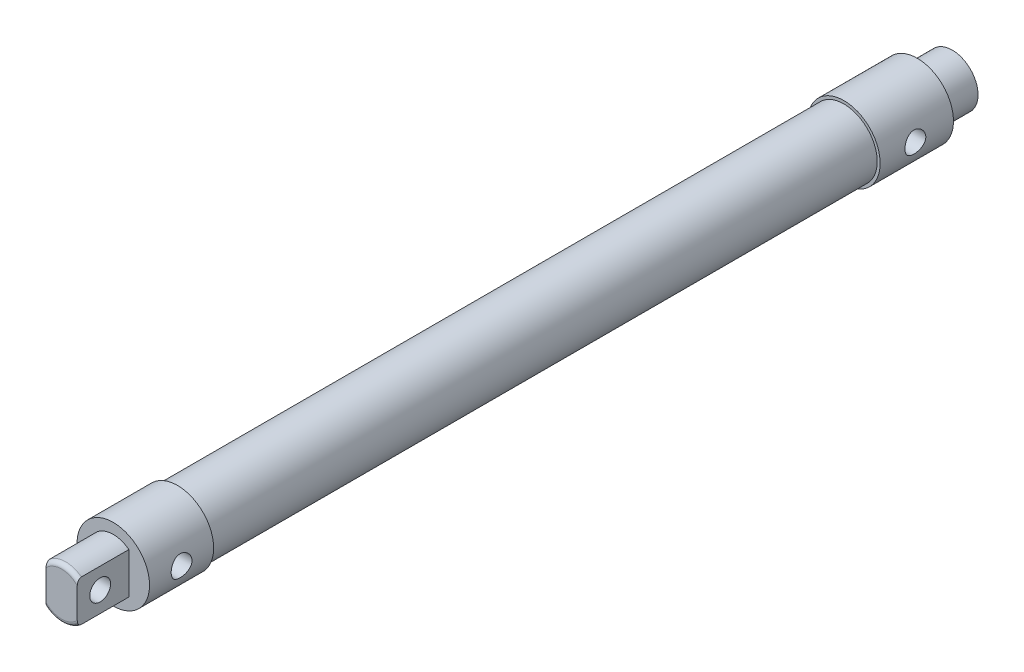
ISO-10303-21;
HEADER;
FILE_DESCRIPTION(('STEP AP214'),'2;1');
FILE_NAME('part.step','',(''),(''),'','','');
FILE_SCHEMA(('AUTOMOTIVE_DESIGN { 1 0 10303 214 1 1 1 1 }'));
ENDSEC;
DATA;
#1=APPLICATION_CONTEXT('core data for automotive mechanical design processes');
#2=APPLICATION_PROTOCOL_DEFINITION('international standard','automotive_design',2000,#1);
#3=PRODUCT_CONTEXT('',#1,'mechanical');
#4=PRODUCT('Part','Part','',(#3));
#5=PRODUCT_RELATED_PRODUCT_CATEGORY('part','',(#4));
#6=PRODUCT_DEFINITION_FORMATION('','',#4);
#7=PRODUCT_DEFINITION_CONTEXT('part definition',#1,'design');
#8=PRODUCT_DEFINITION('design','',#6,#7);
#9=PRODUCT_DEFINITION_SHAPE('','',#8);
#10=(LENGTH_UNIT() NAMED_UNIT(*) SI_UNIT(.MILLI.,.METRE.));
#11=(NAMED_UNIT(*) PLANE_ANGLE_UNIT() SI_UNIT($,.RADIAN.));
#12=(NAMED_UNIT(*) SI_UNIT($,.STERADIAN.) SOLID_ANGLE_UNIT());
#13=UNCERTAINTY_MEASURE_WITH_UNIT(LENGTH_MEASURE(1.E-05),#10,'distance_accuracy_value','');
#14=(GEOMETRIC_REPRESENTATION_CONTEXT(3) GLOBAL_UNCERTAINTY_ASSIGNED_CONTEXT((#13)) GLOBAL_UNIT_ASSIGNED_CONTEXT((#10,
#11,#12)) REPRESENTATION_CONTEXT('',''));
#15=CARTESIAN_POINT('',(0.,0.,0.));
#16=DIRECTION('',(0.,0.,1.));
#17=DIRECTION('',(1.,0.,0.));
#18=AXIS2_PLACEMENT_3D('',#15,#16,#17);
#19=CARTESIAN_POINT('',(0.,0.,222.758));
#20=DIRECTION('',(0.,0.,-1.));
#21=DIRECTION('',(-1.,0.,0.));
#22=AXIS2_PLACEMENT_3D('',#19,#20,#21);
#23=CYLINDRICAL_SURFACE('',#22,11.049);
#24=CARTESIAN_POINT('',(0.,0.,222.758));
#25=DIRECTION('',(0.,0.,1.));
#26=DIRECTION('',(1.,0.,0.));
#27=AXIS2_PLACEMENT_3D('',#24,#25,#26);
#28=CIRCLE('',#27,11.049);
#29=CARTESIAN_POINT('',(11.049,0.,222.758));
#30=VERTEX_POINT('',#29);
#31=EDGE_CURVE('E137',#30,#30,#28,.T.);
#32=ORIENTED_EDGE('',*,*,#31,.F.);
#33=EDGE_LOOP('',(#32));
#34=FACE_BOUND('',#33,.T.);
#35=CARTESIAN_POINT('',(0.,0.,203.2));
#36=DIRECTION('',(0.,0.,1.));
#37=DIRECTION('',(1.,0.,0.));
#38=AXIS2_PLACEMENT_3D('',#35,#36,#37);
#39=CIRCLE('',#38,11.049);
#40=CARTESIAN_POINT('',(11.049,0.,203.2));
#41=VERTEX_POINT('',#40);
#42=EDGE_CURVE('E110',#41,#41,#39,.T.);
#43=ORIENTED_EDGE('',*,*,#42,.T.);
#44=EDGE_LOOP('',(#43));
#45=FACE_BOUND('',#44,.T.);
#46=CARTESIAN_POINT('',(10.5829946612478,-3.175,212.979));
#47=CARTESIAN_POINT('',(10.5829970378921,-3.17499696173694,213.153343169612));
#48=CARTESIAN_POINT('',(10.5873499628536,-3.16059101598809,213.327716945003));
#49=CARTESIAN_POINT('',(10.6042287733974,-3.10348071440142,213.671390818407));
#50=CARTESIAN_POINT('',(10.6167579154399,-3.06076508315063,213.840688866724));
#51=CARTESIAN_POINT('',(10.6484555361327,-2.94858604276688,214.169188103751));
#52=CARTESIAN_POINT('',(10.6676136440502,-2.87916439519901,214.328404607024));
#53=CARTESIAN_POINT('',(10.7103968556723,-2.71567886194748,214.632964989182));
#54=CARTESIAN_POINT('',(10.7340225055439,-2.62161196278527,214.778307168628));
#55=CARTESIAN_POINT('',(10.7838478929209,-2.40858326173654,215.055212977893));
#56=CARTESIAN_POINT('',(10.8100989589948,-2.28903221307922,215.18631415544));
#57=CARTESIAN_POINT('',(10.8617771284488,-2.02969339145334,215.42690970103));
#58=CARTESIAN_POINT('',(10.8872041340175,-1.88990322690513,215.536401511957));
#59=CARTESIAN_POINT('',(10.9349482869144,-1.59079703436562,215.732647008809));
#60=CARTESIAN_POINT('',(10.9571978703645,-1.43116293599984,215.818933781985));
#61=CARTESIAN_POINT('',(10.9954868205641,-1.09890403668003,215.96326239608));
#62=CARTESIAN_POINT('',(11.0115274108589,-0.926281803186645,216.021309802432));
#63=CARTESIAN_POINT('',(11.0352279538983,-0.577780737066111,216.105994767518));
#64=CARTESIAN_POINT('',(11.0430978601515,-0.402107999548955,216.133420654298));
#65=CARTESIAN_POINT('',(11.0503076095615,-0.0484902253797454,216.158571865806));
#66=CARTESIAN_POINT('',(11.0496491013871,0.129454365444983,216.156302930981));
#67=CARTESIAN_POINT('',(11.0400267625263,0.477051272742436,216.122668276694));
#68=CARTESIAN_POINT('',(11.0313063870296,0.646793905386206,216.092155443166));
#69=CARTESIAN_POINT('',(11.0068326238017,0.978639250638344,216.004286301785));
#70=CARTESIAN_POINT('',(10.991078806017,1.14074149541178,215.9469283525));
#71=CARTESIAN_POINT('',(10.9539621303433,1.45479040406771,215.806390262368));
#72=CARTESIAN_POINT('',(10.9325393858836,1.60660549873713,215.722932582088));
#73=CARTESIAN_POINT('',(10.8863714985496,1.89435605989025,215.532780903117));
#74=CARTESIAN_POINT('',(10.8616256211488,2.03028800319436,215.426081764014));
#75=CARTESIAN_POINT('',(10.8104367437012,2.28750533131606,215.188010769114));
#76=CARTESIAN_POINT('',(10.7839646808932,2.4080998224991,215.055897758046));
#77=CARTESIAN_POINT('',(10.733084389821,2.62560689303648,214.773057770274));
#78=CARTESIAN_POINT('',(10.7086763331534,2.72251750463205,214.622329248477));
#79=CARTESIAN_POINT('',(10.6645569111701,2.89054812362864,214.304845080252));
#80=CARTESIAN_POINT('',(10.6448854814472,2.96145130546497,214.137968727805));
#81=CARTESIAN_POINT('',(10.6129476152519,3.07395555813915,213.793952244113));
#82=CARTESIAN_POINT('',(10.6006789953196,3.11556526969434,213.616815156186));
#83=CARTESIAN_POINT('',(10.585409663935,3.16704977828252,213.263836916255));
#84=CARTESIAN_POINT('',(10.5821046142205,3.17796715559108,213.088160853244));
#85=CARTESIAN_POINT('',(10.5842985066283,3.17065339734403,212.73748705244));
#86=CARTESIAN_POINT('',(10.5897963357224,3.15242594683498,212.562489231694));
#87=CARTESIAN_POINT('',(10.6086796202177,3.08826497319619,212.222355741259));
#88=CARTESIAN_POINT('',(10.6218788212302,3.04298510170738,212.057085396053));
#89=CARTESIAN_POINT('',(10.654488955992,2.92675343849824,211.736492795518));
#90=CARTESIAN_POINT('',(10.6739007932801,2.85579791242603,211.581171991154));
#91=CARTESIAN_POINT('',(10.7173525725105,2.68819763195384,211.280599406866));
#92=CARTESIAN_POINT('',(10.7414960228918,2.59095536802795,211.135696126875));
#93=CARTESIAN_POINT('',(10.7914602367789,2.37426353068631,210.86388230724));
#94=CARTESIAN_POINT('',(10.8172813672868,2.25480908751678,210.736975723931));
#95=CARTESIAN_POINT('',(10.8687608358398,1.99221286364236,210.500289244861));
#96=CARTESIAN_POINT('',(10.8943833784092,1.84840048120927,210.391243871948));
#97=CARTESIAN_POINT('',(10.9416824947104,1.54391896032716,210.198826470589));
#98=CARTESIAN_POINT('',(10.963359273833,1.38325069997256,210.115453105667));
#99=CARTESIAN_POINT('',(11.0001869824692,1.05072587538091,209.9775439009));
#100=CARTESIAN_POINT('',(11.0153871097535,0.878965503598176,209.922789914279));
#101=CARTESIAN_POINT('',(11.0377661850788,0.528171227762868,209.843080708093));
#102=CARTESIAN_POINT('',(11.0449472223555,0.349139230810322,209.818117726877));
#103=CARTESIAN_POINT('',(11.0503629040812,-0.0043004314825108,209.799249313813));
#104=CARTESIAN_POINT('',(11.0489056996126,-0.178647014664058,209.804274173031));
#105=CARTESIAN_POINT('',(11.0379233962819,-0.523908669717712,209.842710416543));
#106=CARTESIAN_POINT('',(11.0283986915624,-0.69482390881256,209.876120414065));
#107=CARTESIAN_POINT('',(11.0024294098578,-1.02686681719942,209.969737297699));
#108=CARTESIAN_POINT('',(10.9860488399852,-1.18806963267257,210.02969660909));
#109=CARTESIAN_POINT('',(10.9480678507565,-1.49821572280082,210.174489786631));
#110=CARTESIAN_POINT('',(10.9264666173167,-1.64715708060557,210.259327532639));
#111=CARTESIAN_POINT('',(10.8795235460163,-1.933403848412,210.454427082047));
#112=CARTESIAN_POINT('',(10.8540889319085,-2.0702261392825,210.565375246748));
#113=CARTESIAN_POINT('',(10.8026716112853,-2.32367039959815,210.808284755922));
#114=CARTESIAN_POINT('',(10.7766887543745,-2.44028674310768,210.940251933144));
#115=CARTESIAN_POINT('',(10.7263080053237,-2.65311527076296,211.225680346804));
#116=CARTESIAN_POINT('',(10.7019708346248,-2.74870060488381,211.379620812702));
#117=CARTESIAN_POINT('',(10.6585601925368,-2.91251111919759,211.702065252359));
#118=CARTESIAN_POINT('',(10.6394838228281,-2.98075137397165,211.870561139667));
#119=CARTESIAN_POINT('',(10.6109457090473,-3.08067604297107,212.194782717456));
#120=CARTESIAN_POINT('',(10.6005573203454,-3.11595595609863,212.349326717797));
#121=CARTESIAN_POINT('',(10.5865812685406,-3.16311741659185,212.662239141281));
#122=CARTESIAN_POINT('',(10.5829925020353,-3.17500276030191,212.820606939695));
#123=CARTESIAN_POINT('',(10.5829946612478,-3.175,212.979));
#124=B_SPLINE_CURVE_WITH_KNOTS('',3,(#46,#47,#48,#49,#50,#51,#52,#53,#54,#55,#56,#57,#58,#59,
#60,#61,#62,#63,#64,#65,#66,#67,#68,#69,#70,#71,#72,#73,#74,#75,#76,#77,#78,#79,#80,#81,#82,#83,
#84,#85,#86,#87,#88,#89,#90,#91,#92,#93,#94,#95,#96,#97,#98,#99,#100,#101,#102,#103,#104,#105,
#106,#107,#108,#109,#110,#111,#112,#113,#114,#115,#116,#117,#118,#119,#120,#121,#122,#123),
.UNSPECIFIED.,.T.,.F.,(4,2,2,2,2,2,2,2,2,2,2,2,2,2,2,2,2,2,2,2,2,2,2,2,2,2,2,2,2,2,2,2,2,2,2,2,
2,2,4),(0.,0.522445971515632,1.04510015223568,1.56694033248866,2.08884435013763,
2.62446334981221,3.16014569329023,3.70591356848467,4.25157383973315,4.78283705764744,
5.31399757604566,5.82962412489645,6.34528220559619,6.86662167203277,7.38807656264308,
7.92803521591126,8.46803871603088,9.01244709372958,9.55669481951293,10.0822178130475,
10.6076743651684,11.1209208176782,11.6342419484684,12.1603874377864,12.6866484144843,
13.230914757694,13.7751527618185,14.3151795683735,14.8550656473995,15.375811108637,
15.8965311300157,16.4124944283517,16.9285382353607,17.4600631929064,17.9917359057943,
18.5375828018549,19.0831283723763,19.5578544443061,20.0325034738991),.UNSPECIFIED.);
#125=CARTESIAN_POINT('',(10.5829946612478,-3.175,212.979));
#126=VERTEX_POINT('',#125);
#127=EDGE_CURVE('E211',#126,#126,#124,.T.);
#128=ORIENTED_EDGE('',*,*,#127,.T.);
#129=EDGE_LOOP('',(#128));
#130=FACE_BOUND('',#129,.T.);
#131=ADVANCED_FACE('F48',(#34,#45,#130),#23,.T.);
#132=CARTESIAN_POINT('',(0.,0.,222.758));
#133=DIRECTION('',(0.,0.,1.));
#134=DIRECTION('',(1.,0.,0.));
#135=AXIS2_PLACEMENT_3D('',#132,#133,#134);
#136=PLANE('',#135);
#137=ORIENTED_EDGE('',*,*,#31,.T.);
#138=EDGE_LOOP('',(#137));
#139=FACE_BOUND('',#138,.T.);
#140=DIRECTION('',(0.,-1.,0.));
#141=VECTOR('',#140,1.);
#142=CARTESIAN_POINT('',(-4.7625,-6.27044414296148,222.758));
#143=LINE('',#142,#141);
#144=CARTESIAN_POINT('',(-4.7625,6.27044414296148,222.758));
#145=VERTEX_POINT('',#144);
#146=CARTESIAN_POINT('',(-4.7625,-6.27044414296148,222.758));
#147=VERTEX_POINT('',#146);
#148=EDGE_CURVE('E107',#145,#147,#143,.T.);
#149=ORIENTED_EDGE('',*,*,#148,.F.);
#150=CARTESIAN_POINT('',(0.,0.,222.758));
#151=DIRECTION('',(0.,0.,1.));
#152=DIRECTION('',(1.,0.,0.));
#153=AXIS2_PLACEMENT_3D('',#150,#151,#152);
#154=CIRCLE('',#153,7.874);
#155=CARTESIAN_POINT('',(4.7625,6.27044414296148,222.758));
#156=VERTEX_POINT('',#155);
#157=EDGE_CURVE('E114',#156,#145,#154,.T.);
#158=ORIENTED_EDGE('',*,*,#157,.F.);
#159=DIRECTION('',(0.,1.,0.));
#160=VECTOR('',#159,1.);
#161=CARTESIAN_POINT('',(4.7625,-6.27044414296148,222.758));
#162=LINE('',#161,#160);
#163=CARTESIAN_POINT('',(4.7625,-6.27044414296148,222.758));
#164=VERTEX_POINT('',#163);
#165=EDGE_CURVE('E126',#164,#156,#162,.T.);
#166=ORIENTED_EDGE('',*,*,#165,.F.);
#167=CARTESIAN_POINT('',(0.,0.,222.758));
#168=DIRECTION('',(0.,0.,1.));
#169=DIRECTION('',(1.,0.,0.));
#170=AXIS2_PLACEMENT_3D('',#167,#168,#169);
#171=CIRCLE('',#170,7.874);
#172=EDGE_CURVE('E124',#147,#164,#171,.T.);
#173=ORIENTED_EDGE('',*,*,#172,.F.);
#174=EDGE_LOOP('',(#149,#158,#166,#173));
#175=FACE_BOUND('',#174,.T.);
#176=ADVANCED_FACE('F122',(#139,#175),#136,.T.);
#177=CARTESIAN_POINT('',(0.,0.,203.2));
#178=DIRECTION('',(0.,0.,1.));
#179=DIRECTION('',(1.,0.,0.));
#180=AXIS2_PLACEMENT_3D('',#177,#178,#179);
#181=PLANE('',#180);
#182=ORIENTED_EDGE('',*,*,#42,.F.);
#183=EDGE_LOOP('',(#182));
#184=FACE_BOUND('',#183,.T.);
#185=ADVANCED_FACE('F168',(#184),#181,.F.);
#186=CARTESIAN_POINT('',(0.,0.,238.506));
#187=DIRECTION('',(0.,0.,-1.));
#188=DIRECTION('',(-1.,0.,0.));
#189=AXIS2_PLACEMENT_3D('',#186,#187,#188);
#190=CYLINDRICAL_SURFACE('',#189,7.874);
#191=DIRECTION('',(0.,0.,-1.));
#192=VECTOR('',#191,1.);
#193=CARTESIAN_POINT('',(-4.7625,6.27044414296148,238.506));
#194=LINE('',#193,#192);
#195=CARTESIAN_POINT('',(-4.7625,6.27044414296148,237.236));
#196=VERTEX_POINT('',#195);
#197=EDGE_CURVE('E101',#196,#145,#194,.T.);
#198=ORIENTED_EDGE('',*,*,#197,.F.);
#199=CARTESIAN_POINT('',(0.,0.,237.236));
#200=DIRECTION('',(0.,0.,1.));
#201=DIRECTION('',(1.,0.,0.));
#202=AXIS2_PLACEMENT_3D('',#199,#200,#201);
#203=CIRCLE('',#202,7.874);
#204=CARTESIAN_POINT('',(4.7625,6.27044414296148,237.236));
#205=VERTEX_POINT('',#204);
#206=EDGE_CURVE('E72',#196,#205,#203,.F.);
#207=ORIENTED_EDGE('',*,*,#206,.T.);
#208=DIRECTION('',(0.,0.,-1.));
#209=VECTOR('',#208,1.);
#210=CARTESIAN_POINT('',(4.7625,6.27044414296148,238.506));
#211=LINE('',#210,#209);
#212=EDGE_CURVE('E116',#205,#156,#211,.T.);
#213=ORIENTED_EDGE('',*,*,#212,.T.);
#214=ORIENTED_EDGE('',*,*,#157,.T.);
#215=EDGE_LOOP('',(#198,#207,#213,#214));
#216=FACE_BOUND('',#215,.T.);
#217=ADVANCED_FACE('F115',(#216),#190,.T.);
#218=CARTESIAN_POINT('',(-4.7625,-6.27044414296148,238.506));
#219=DIRECTION('',(1.,0.,0.));
#220=DIRECTION('',(0.,1.,0.));
#221=AXIS2_PLACEMENT_3D('',#218,#219,#220);
#222=PLANE('',#221);
#223=CARTESIAN_POINT('',(-4.7625,0.,231.521));
#224=DIRECTION('',(1.,0.,0.));
#225=DIRECTION('',(0.,1.,0.));
#226=AXIS2_PLACEMENT_3D('',#223,#224,#225);
#227=CIRCLE('',#226,3.175);
#228=CARTESIAN_POINT('',(-4.7625,3.175,231.521));
#229=VERTEX_POINT('',#228);
#230=EDGE_CURVE('E120',#229,#229,#227,.F.);
#231=ORIENTED_EDGE('',*,*,#230,.F.);
#232=EDGE_LOOP('',(#231));
#233=FACE_BOUND('',#232,.T.);
#234=DIRECTION('',(0.,-1.,0.));
#235=VECTOR('',#234,1.);
#236=CARTESIAN_POINT('',(-4.7625,-6.27044414296148,238.506));
#237=LINE('',#236,#235);
#238=CARTESIAN_POINT('',(-4.7625,4.57508576422344,238.506));
#239=VERTEX_POINT('',#238);
#240=CARTESIAN_POINT('',(-4.7625,-4.57508576422344,238.506));
#241=VERTEX_POINT('',#240);
#242=EDGE_CURVE('E131',#239,#241,#237,.T.);
#243=ORIENTED_EDGE('',*,*,#242,.F.);
#244=CARTESIAN_POINT('',(-4.7625,4.57508576422344,238.506));
#245=CARTESIAN_POINT('',(-4.7625,4.70491371485058,238.505988992306));
#246=CARTESIAN_POINT('',(-4.7625,4.83558278945041,238.49641170347));
#247=CARTESIAN_POINT('',(-4.7625,5.09465420787404,238.454901270244));
#248=CARTESIAN_POINT('',(-4.7625,5.22301707247969,238.422728857364));
#249=CARTESIAN_POINT('',(-4.7625,5.42870338399685,238.347882839221));
#250=CARTESIAN_POINT('',(-4.7625,5.50862070615665,238.312427605347));
#251=CARTESIAN_POINT('',(-4.7625,5.66172310725952,238.229556838602));
#252=CARTESIAN_POINT('',(-4.7625,5.73493413756743,238.182190319702));
#253=CARTESIAN_POINT('',(-4.7625,5.85954621136901,238.08471115017));
#254=CARTESIAN_POINT('',(-4.7625,5.91250696068592,238.036601100032));
#255=CARTESIAN_POINT('',(-4.7625,6.00991201638405,237.932266864641));
#256=CARTESIAN_POINT('',(-4.7625,6.05435186214026,237.876038456345));
#257=CARTESIAN_POINT('',(-4.7625,6.13268330527644,237.755874884677));
#258=CARTESIAN_POINT('',(-4.7625,6.16647767328859,237.691875685665));
#259=CARTESIAN_POINT('',(-4.7625,6.22061826265152,237.558469254315));
#260=CARTESIAN_POINT('',(-4.7625,6.24099787353805,237.489075933595));
#261=CARTESIAN_POINT('',(-4.7625,6.25939312554719,237.388328586812));
#262=CARTESIAN_POINT('',(-4.7625,6.26353112778692,237.358002020549));
#263=CARTESIAN_POINT('',(-4.7625,6.26905575751435,237.297123988509));
#264=CARTESIAN_POINT('',(-4.7625,6.27044458262064,237.266572721978));
#265=CARTESIAN_POINT('',(-4.7625,6.27044414296148,237.236));
#266=B_SPLINE_CURVE_WITH_KNOTS('',3,(#244,#245,#246,#247,#248,#249,#250,#251,#252,#253,#254,
#255,#256,#257,#258,#259,#260,#261,#262,#263,#264,#265),.UNSPECIFIED.,.F.,.F.,(4,2,2,2,2,2,2,2,
2,2,4),(0.,0.39051208259768,0.78522304838607,1.0466017287982,1.30692197058371,1.52073252531684,
1.73465470439591,1.95047758121081,2.16576121964787,2.2574793882026,2.34912421005429),.UNSPECIFIED.);
#267=EDGE_CURVE('E109',#239,#196,#266,.T.);
#268=ORIENTED_EDGE('',*,*,#267,.T.);
#269=ORIENTED_EDGE('',*,*,#197,.T.);
#270=ORIENTED_EDGE('',*,*,#148,.T.);
#271=DIRECTION('',(0.,0.,-1.));
#272=VECTOR('',#271,1.);
#273=CARTESIAN_POINT('',(-4.7625,-6.27044414296148,238.506));
#274=LINE('',#273,#272);
#275=CARTESIAN_POINT('',(-4.7625,-6.27044414296148,237.236));
#276=VERTEX_POINT('',#275);
#277=EDGE_CURVE('E111',#276,#147,#274,.T.);
#278=ORIENTED_EDGE('',*,*,#277,.F.);
#279=CARTESIAN_POINT('',(-4.7625,-6.27044414296148,237.236));
#280=CARTESIAN_POINT('',(-4.7625,-6.27044695744103,237.266318737493));
#281=CARTESIAN_POINT('',(-4.7625,-6.26907969386892,237.296620938918));
#282=CARTESIAN_POINT('',(-4.7625,-6.26364600379126,237.356969671006));
#283=CARTESIAN_POINT('',(-4.7625,-6.25958072650012,237.387016305011));
#284=CARTESIAN_POINT('',(-4.7625,-6.24346537985301,237.476103039148));
#285=CARTESIAN_POINT('',(-4.7625,-6.22749460557059,237.534476323768));
#286=CARTESIAN_POINT('',(-4.7625,-6.18599695256506,237.647565139999));
#287=CARTESIAN_POINT('',(-4.7625,-6.16048225576697,237.702285230088));
#288=CARTESIAN_POINT('',(-4.7625,-6.10112984915439,237.80705512157));
#289=CARTESIAN_POINT('',(-4.7625,-6.06728241065118,237.857099368899));
#290=CARTESIAN_POINT('',(-4.7625,-5.99039711728846,237.954581778947));
#291=CARTESIAN_POINT('',(-4.7625,-5.94692476500161,238.001675051199));
#292=CARTESIAN_POINT('',(-4.7625,-5.85384044814122,238.089249704828));
#293=CARTESIAN_POINT('',(-4.7625,-5.80422853679333,238.129731143517));
#294=CARTESIAN_POINT('',(-4.7625,-5.67534049300728,238.221859726782));
#295=CARTESIAN_POINT('',(-4.7625,-5.59323792773677,238.269567571663));
#296=CARTESIAN_POINT('',(-4.7625,-5.4221626065094,238.351174178103));
#297=CARTESIAN_POINT('',(-4.7625,-5.33316043671503,238.385009459685));
#298=CARTESIAN_POINT('',(-4.7625,-5.13378043928996,238.445050891071));
#299=CARTESIAN_POINT('',(-4.7625,-5.02259523817667,238.46851969187));
#300=CARTESIAN_POINT('',(-4.7625,-4.79915137908821,238.498894386153));
#301=CARTESIAN_POINT('',(-4.7625,-4.68691720505674,238.505976060827));
#302=CARTESIAN_POINT('',(-4.7625,-4.57508576422343,238.506));
#303=B_SPLINE_CURVE_WITH_KNOTS('',3,(#279,#280,#281,#282,#283,#284,#285,#286,#287,#288,#289,
#290,#291,#292,#293,#294,#295,#296,#297,#298,#299,#300,#301,#302),.UNSPECIFIED.,.F.,.F.,(4,2,2,
2,2,2,2,2,2,2,2,4),(0.,0.0908934298733198,0.181748168669647,0.362315077107754,0.542652290896588,
0.723201059897692,0.914757181637321,1.1063116428368,1.38961771540343,1.67420608669172,
2.01378321177533,2.34970053458326),.UNSPECIFIED.);
#304=EDGE_CURVE('E148',#276,#241,#303,.T.);
#305=ORIENTED_EDGE('',*,*,#304,.T.);
#306=EDGE_LOOP('',(#243,#268,#269,#270,#278,#305));
#307=FACE_BOUND('',#306,.T.);
#308=ADVANCED_FACE('F104',(#233,#307),#222,.F.);
#309=CARTESIAN_POINT('',(0.,0.,238.506));
#310=DIRECTION('',(0.,0.,-1.));
#311=DIRECTION('',(-1.,0.,0.));
#312=AXIS2_PLACEMENT_3D('',#309,#310,#311);
#313=CYLINDRICAL_SURFACE('',#312,7.874);
#314=DIRECTION('',(0.,0.,-1.));
#315=VECTOR('',#314,1.);
#316=CARTESIAN_POINT('',(4.7625,-6.27044414296148,238.506));
#317=LINE('',#316,#315);
#318=CARTESIAN_POINT('',(4.7625,-6.27044414296148,237.236));
#319=VERTEX_POINT('',#318);
#320=EDGE_CURVE('E133',#319,#164,#317,.T.);
#321=ORIENTED_EDGE('',*,*,#320,.F.);
#322=CARTESIAN_POINT('',(0.,0.,237.236));
#323=DIRECTION('',(0.,0.,1.));
#324=DIRECTION('',(1.,0.,0.));
#325=AXIS2_PLACEMENT_3D('',#322,#323,#324);
#326=CIRCLE('',#325,7.874);
#327=EDGE_CURVE('E12',#319,#276,#326,.F.);
#328=ORIENTED_EDGE('',*,*,#327,.T.);
#329=ORIENTED_EDGE('',*,*,#277,.T.);
#330=ORIENTED_EDGE('',*,*,#172,.T.);
#331=EDGE_LOOP('',(#321,#328,#329,#330));
#332=FACE_BOUND('',#331,.T.);
#333=ADVANCED_FACE('F162',(#332),#313,.T.);
#334=CARTESIAN_POINT('',(4.7625,-6.27044414296148,238.506));
#335=DIRECTION('',(-1.,0.,0.));
#336=DIRECTION('',(0.,0.,1.));
#337=AXIS2_PLACEMENT_3D('',#334,#335,#336);
#338=PLANE('',#337);
#339=CARTESIAN_POINT('',(4.7625,0.,231.521));
#340=DIRECTION('',(1.,0.,0.));
#341=DIRECTION('',(0.,0.,-1.));
#342=AXIS2_PLACEMENT_3D('',#339,#340,#341);
#343=CIRCLE('',#342,3.175);
#344=CARTESIAN_POINT('',(4.7625,0.,228.346));
#345=VERTEX_POINT('',#344);
#346=EDGE_CURVE('E218',#345,#345,#343,.T.);
#347=ORIENTED_EDGE('',*,*,#346,.F.);
#348=EDGE_LOOP('',(#347));
#349=FACE_BOUND('',#348,.T.);
#350=ORIENTED_EDGE('',*,*,#212,.F.);
#351=CARTESIAN_POINT('',(4.7625,6.27044414296148,237.236));
#352=CARTESIAN_POINT('',(4.7625,6.27044695744103,237.266318737493));
#353=CARTESIAN_POINT('',(4.7625,6.26907969386892,237.296620938918));
#354=CARTESIAN_POINT('',(4.7625,6.26364600379126,237.356969671006));
#355=CARTESIAN_POINT('',(4.7625,6.25958072650012,237.387016305011));
#356=CARTESIAN_POINT('',(4.7625,6.24346537985301,237.476103039148));
#357=CARTESIAN_POINT('',(4.7625,6.22749460557059,237.534476323768));
#358=CARTESIAN_POINT('',(4.7625,6.18599695256506,237.647565139999));
#359=CARTESIAN_POINT('',(4.7625,6.16048225576698,237.702285230088));
#360=CARTESIAN_POINT('',(4.7625,6.10112984915441,237.80705512157));
#361=CARTESIAN_POINT('',(4.7625,6.0672824106512,237.857099368899));
#362=CARTESIAN_POINT('',(4.7625,5.99039711728846,237.954581778947));
#363=CARTESIAN_POINT('',(4.7625,5.94692476500161,238.001675051199));
#364=CARTESIAN_POINT('',(4.7625,5.85384044814122,238.089249704828));
#365=CARTESIAN_POINT('',(4.7625,5.80422853679333,238.129731143517));
#366=CARTESIAN_POINT('',(4.7625,5.67534049300728,238.221859726782));
#367=CARTESIAN_POINT('',(4.7625,5.59323792773677,238.269567571663));
#368=CARTESIAN_POINT('',(4.7625,5.4221626065094,238.351174178103));
#369=CARTESIAN_POINT('',(4.7625,5.33316043671503,238.385009459685));
#370=CARTESIAN_POINT('',(4.7625,5.13378043928996,238.445050891071));
#371=CARTESIAN_POINT('',(4.7625,5.02259523817667,238.46851969187));
#372=CARTESIAN_POINT('',(4.7625,4.79915137908821,238.498894386153));
#373=CARTESIAN_POINT('',(4.7625,4.68691720505674,238.505976060827));
#374=CARTESIAN_POINT('',(4.7625,4.57508576422343,238.506));
#375=B_SPLINE_CURVE_WITH_KNOTS('',3,(#351,#352,#353,#354,#355,#356,#357,#358,#359,#360,#361,
#362,#363,#364,#365,#366,#367,#368,#369,#370,#371,#372,#373,#374),.UNSPECIFIED.,.F.,.F.,(4,2,2,
2,2,2,2,2,2,2,2,4),(0.,0.0908934298733198,0.181748168669647,0.362315077107754,0.542652290896525,
0.723201059897692,0.914757181637321,1.1063116428368,1.38961771540343,1.67420608669172,
2.01378321177533,2.34970053458326),.UNSPECIFIED.);
#376=CARTESIAN_POINT('',(4.7625,4.57508576422344,238.506));
#377=VERTEX_POINT('',#376);
#378=EDGE_CURVE('E57',#205,#377,#375,.T.);
#379=ORIENTED_EDGE('',*,*,#378,.T.);
#380=DIRECTION('',(0.,1.,0.));
#381=VECTOR('',#380,1.);
#382=CARTESIAN_POINT('',(4.7625,-6.27044414296148,238.506));
#383=LINE('',#382,#381);
#384=CARTESIAN_POINT('',(4.7625,-4.57508576422344,238.506));
#385=VERTEX_POINT('',#384);
#386=EDGE_CURVE('E134',#385,#377,#383,.T.);
#387=ORIENTED_EDGE('',*,*,#386,.F.);
#388=CARTESIAN_POINT('',(4.7625,-4.57508576422344,238.506));
#389=CARTESIAN_POINT('',(4.7625,-4.70491371485057,238.505988992306));
#390=CARTESIAN_POINT('',(4.7625,-4.8355827894504,238.49641170347));
#391=CARTESIAN_POINT('',(4.7625,-5.09465420787404,238.454901270244));
#392=CARTESIAN_POINT('',(4.7625,-5.22301707247969,238.422728857364));
#393=CARTESIAN_POINT('',(4.7625,-5.42870338399685,238.347882839221));
#394=CARTESIAN_POINT('',(4.7625,-5.50862070615664,238.312427605347));
#395=CARTESIAN_POINT('',(4.7625,-5.66172310725951,238.229556838602));
#396=CARTESIAN_POINT('',(4.7625,-5.73493413756743,238.182190319702));
#397=CARTESIAN_POINT('',(4.7625,-5.85954621136903,238.08471115017));
#398=CARTESIAN_POINT('',(4.7625,-5.91250696068595,238.036601100032));
#399=CARTESIAN_POINT('',(4.7625,-6.00991201638407,237.932266864641));
#400=CARTESIAN_POINT('',(4.7625,-6.05435186214028,237.876038456345));
#401=CARTESIAN_POINT('',(4.7625,-6.13268330527646,237.755874884677));
#402=CARTESIAN_POINT('',(4.7625,-6.16647767328861,237.691875685665));
#403=CARTESIAN_POINT('',(4.7625,-6.22061826265153,237.558469254315));
#404=CARTESIAN_POINT('',(4.7625,-6.24099787353805,237.489075933595));
#405=CARTESIAN_POINT('',(4.7625,-6.25939312554719,237.388328586812));
#406=CARTESIAN_POINT('',(4.7625,-6.26353112778692,237.358002020549));
#407=CARTESIAN_POINT('',(4.7625,-6.26905575751435,237.297123988509));
#408=CARTESIAN_POINT('',(4.7625,-6.27044458262064,237.266572721978));
#409=CARTESIAN_POINT('',(4.7625,-6.27044414296148,237.236));
#410=B_SPLINE_CURVE_WITH_KNOTS('',3,(#388,#389,#390,#391,#392,#393,#394,#395,#396,#397,#398,
#399,#400,#401,#402,#403,#404,#405,#406,#407,#408,#409),.UNSPECIFIED.,.F.,.F.,(4,2,2,2,2,2,2,2,
2,2,4),(0.,0.390512082597677,0.78522304838607,1.04660172879819,1.30692197058371,
1.52073252531691,1.73465470439593,1.95047758121086,2.16576121964789,2.25747938820262,
2.34912421005428),.UNSPECIFIED.);
#411=EDGE_CURVE('E64',#385,#319,#410,.T.);
#412=ORIENTED_EDGE('',*,*,#411,.T.);
#413=ORIENTED_EDGE('',*,*,#320,.T.);
#414=ORIENTED_EDGE('',*,*,#165,.T.);
#415=EDGE_LOOP('',(#350,#379,#387,#412,#413,#414));
#416=FACE_BOUND('',#415,.T.);
#417=ADVANCED_FACE('F190',(#349,#416),#338,.F.);
#418=CARTESIAN_POINT('',(0.,0.,238.506));
#419=DIRECTION('',(0.,0.,1.));
#420=DIRECTION('',(1.,0.,0.));
#421=AXIS2_PLACEMENT_3D('',#418,#419,#420);
#422=PLANE('',#421);
#423=ORIENTED_EDGE('',*,*,#386,.T.);
#424=CARTESIAN_POINT('',(0.,0.,238.506));
#425=DIRECTION('',(0.,0.,1.));
#426=DIRECTION('',(1.,0.,0.));
#427=AXIS2_PLACEMENT_3D('',#424,#425,#426);
#428=CIRCLE('',#427,6.604);
#429=EDGE_CURVE('E145',#377,#239,#428,.T.);
#430=ORIENTED_EDGE('',*,*,#429,.T.);
#431=ORIENTED_EDGE('',*,*,#242,.T.);
#432=CARTESIAN_POINT('',(0.,0.,238.506));
#433=DIRECTION('',(0.,0.,1.));
#434=DIRECTION('',(1.,0.,0.));
#435=AXIS2_PLACEMENT_3D('',#432,#433,#434);
#436=CIRCLE('',#435,6.604);
#437=EDGE_CURVE('E140',#241,#385,#436,.T.);
#438=ORIENTED_EDGE('',*,*,#437,.T.);
#439=EDGE_LOOP('',(#423,#430,#431,#438));
#440=FACE_BOUND('',#439,.T.);
#441=ADVANCED_FACE('F194',(#440),#422,.T.);
#442=CARTESIAN_POINT('',(-11.05,0.,231.521));
#443=DIRECTION('',(1.,0.,0.));
#444=DIRECTION('',(0.,0.,-1.));
#445=AXIS2_PLACEMENT_3D('',#442,#443,#444);
#446=CYLINDRICAL_SURFACE('',#445,3.175);
#447=ORIENTED_EDGE('',*,*,#346,.T.);
#448=EDGE_LOOP('',(#447));
#449=FACE_BOUND('',#448,.T.);
#450=ORIENTED_EDGE('',*,*,#230,.T.);
#451=EDGE_LOOP('',(#450));
#452=FACE_BOUND('',#451,.T.);
#453=ADVANCED_FACE('F180',(#449,#452),#446,.F.);
#454=CARTESIAN_POINT('',(0.,0.,237.236));
#455=DIRECTION('',(0.,0.,1.));
#456=DIRECTION('',(1.,0.,0.));
#457=AXIS2_PLACEMENT_3D('',#454,#455,#456);
#458=TOROIDAL_SURFACE('',#457,6.604,1.27);
#459=ORIENTED_EDGE('',*,*,#378,.F.);
#460=ORIENTED_EDGE('',*,*,#206,.F.);
#461=ORIENTED_EDGE('',*,*,#267,.F.);
#462=ORIENTED_EDGE('',*,*,#429,.F.);
#463=EDGE_LOOP('',(#459,#460,#461,#462));
#464=FACE_BOUND('',#463,.T.);
#465=ADVANCED_FACE('F177',(#464),#458,.T.);
#466=CARTESIAN_POINT('',(0.,0.,237.236));
#467=DIRECTION('',(0.,0.,1.));
#468=DIRECTION('',(1.,0.,0.));
#469=AXIS2_PLACEMENT_3D('',#466,#467,#468);
#470=TOROIDAL_SURFACE('',#469,6.604,1.27);
#471=ORIENTED_EDGE('',*,*,#304,.F.);
#472=ORIENTED_EDGE('',*,*,#327,.F.);
#473=ORIENTED_EDGE('',*,*,#411,.F.);
#474=ORIENTED_EDGE('',*,*,#437,.F.);
#475=EDGE_LOOP('',(#471,#472,#473,#474));
#476=FACE_BOUND('',#475,.T.);
#477=ADVANCED_FACE('F50',(#476),#470,.T.);
#478=CARTESIAN_POINT('',(11.05,0.,212.979));
#479=DIRECTION('',(-1.,0.,0.));
#480=DIRECTION('',(0.,-1.,0.));
#481=AXIS2_PLACEMENT_3D('',#478,#479,#480);
#482=CYLINDRICAL_SURFACE('',#481,3.175);
#483=CARTESIAN_POINT('',(0.,0.,212.979));
#484=DIRECTION('',(1.,0.,0.));
#485=DIRECTION('',(0.,1.,0.));
#486=AXIS2_PLACEMENT_3D('',#483,#484,#485);
#487=CIRCLE('',#486,3.175);
#488=CARTESIAN_POINT('',(0.,3.175,212.979));
#489=VERTEX_POINT('',#488);
#490=EDGE_CURVE('E217',#489,#489,#487,.T.);
#491=ORIENTED_EDGE('',*,*,#490,.F.);
#492=EDGE_LOOP('',(#491));
#493=FACE_BOUND('',#492,.T.);
#494=ORIENTED_EDGE('',*,*,#127,.F.);
#495=EDGE_LOOP('',(#494));
#496=FACE_BOUND('',#495,.T.);
#497=ADVANCED_FACE('F203',(#493,#496),#482,.F.);
#498=CARTESIAN_POINT('',(0.,0.,212.979));
#499=DIRECTION('',(1.,0.,0.));
#500=DIRECTION('',(0.,1.,0.));
#501=AXIS2_PLACEMENT_3D('',#498,#499,#500);
#502=PLANE('',#501);
#503=ORIENTED_EDGE('',*,*,#490,.T.);
#504=EDGE_LOOP('',(#503));
#505=FACE_BOUND('',#504,.T.);
#506=ADVANCED_FACE('F207',(#505),#502,.T.);
#507=CLOSED_SHELL('',(#131,#176,#185,#217,#308,#333,#417,#441,#453,#465,#477,#497,#506));
#508=MANIFOLD_SOLID_BREP('B2',#507);
#509=CARTESIAN_POINT('',(0.,0.,-22.352));
#510=DIRECTION('',(0.,0.,1.));
#511=DIRECTION('',(1.,0.,0.));
#512=AXIS2_PLACEMENT_3D('',#509,#510,#511);
#513=CYLINDRICAL_SURFACE('',#512,11.049);
#514=CARTESIAN_POINT('',(0.,0.,-22.352));
#515=DIRECTION('',(0.,0.,-1.));
#516=DIRECTION('',(-1.,0.,0.));
#517=AXIS2_PLACEMENT_3D('',#514,#515,#516);
#518=CIRCLE('',#517,11.049);
#519=CARTESIAN_POINT('',(-11.049,0.,-22.352));
#520=VERTEX_POINT('',#519);
#521=EDGE_CURVE('E410',#520,#520,#518,.T.);
#522=ORIENTED_EDGE('',*,*,#521,.F.);
#523=EDGE_LOOP('',(#522));
#524=FACE_BOUND('',#523,.T.);
#525=CARTESIAN_POINT('',(0.,0.,0.));
#526=DIRECTION('',(0.,0.,-1.));
#527=DIRECTION('',(-1.,0.,0.));
#528=AXIS2_PLACEMENT_3D('',#525,#526,#527);
#529=CIRCLE('',#528,11.049);
#530=CARTESIAN_POINT('',(-11.049,0.,0.));
#531=VERTEX_POINT('',#530);
#532=EDGE_CURVE('E414',#531,#531,#529,.T.);
#533=ORIENTED_EDGE('',*,*,#532,.T.);
#534=EDGE_LOOP('',(#533));
#535=FACE_BOUND('',#534,.T.);
#536=CARTESIAN_POINT('',(10.5829946612478,-3.175,-10.7397975431835));
#537=CARTESIAN_POINT('',(10.5829970378921,-3.17499696173694,-10.5654543735715));
#538=CARTESIAN_POINT('',(10.5873499628536,-3.16059101598809,-10.3910805981808));
#539=CARTESIAN_POINT('',(10.6042287733974,-3.10348071440142,-10.0474067247768));
#540=CARTESIAN_POINT('',(10.6167579154399,-3.06076508315063,-9.8781086764596));
#541=CARTESIAN_POINT('',(10.6484555361327,-2.94858604276688,-9.54960943943213));
#542=CARTESIAN_POINT('',(10.6676136440502,-2.87916439519901,-9.39039293615923));
#543=CARTESIAN_POINT('',(10.7103968556723,-2.71567886194747,-9.08583255400147));
#544=CARTESIAN_POINT('',(10.7340225055439,-2.62161196278527,-8.94049037455566));
#545=CARTESIAN_POINT('',(10.7838478929209,-2.40858326173655,-8.6635845652905));
#546=CARTESIAN_POINT('',(10.8100989589948,-2.28903221307923,-8.53248338774322));
#547=CARTESIAN_POINT('',(10.8617771284488,-2.02969339145336,-8.29188784215332));
#548=CARTESIAN_POINT('',(10.8872041340175,-1.88990322690514,-8.18239603122611));
#549=CARTESIAN_POINT('',(10.9349482869144,-1.59079703436564,-7.98615053437497));
#550=CARTESIAN_POINT('',(10.9571978703645,-1.43116293599986,-7.89986376119828));
#551=CARTESIAN_POINT('',(10.9954868205641,-1.09890403668005,-7.75553514710404));
#552=CARTESIAN_POINT('',(11.0115274108589,-0.926281803186664,-7.69748774075162));
#553=CARTESIAN_POINT('',(11.0352279538983,-0.577780737066133,-7.61280277566601));
#554=CARTESIAN_POINT('',(11.0430978601515,-0.40210799954898,-7.58537688888545));
#555=CARTESIAN_POINT('',(11.0503076095615,-0.0484902253797718,-7.56022567737788));
#556=CARTESIAN_POINT('',(11.0496491013871,0.129454365444957,-7.56249461220288));
#557=CARTESIAN_POINT('',(11.0400267625263,0.477051272742411,-7.59612926648995));
#558=CARTESIAN_POINT('',(11.0313063870296,0.646793905386182,-7.62664210001776));
#559=CARTESIAN_POINT('',(11.0068326238017,0.978639250638324,-7.71451124139882));
#560=CARTESIAN_POINT('',(10.991078806017,1.14074149541176,-7.77186919068333));
#561=CARTESIAN_POINT('',(10.9539621303433,1.4547904040677,-7.91240728081524));
#562=CARTESIAN_POINT('',(10.9325393858836,1.60660549873712,-7.99586496109587));
#563=CARTESIAN_POINT('',(10.8863714985496,1.89435605989024,-8.18601664006632));
#564=CARTESIAN_POINT('',(10.8616256211488,2.03028800319434,-8.29271577916901));
#565=CARTESIAN_POINT('',(10.8104367437012,2.28750533131605,-8.53078677406985));
#566=CARTESIAN_POINT('',(10.7839646808932,2.4080998224991,-8.66289978513723));
#567=CARTESIAN_POINT('',(10.733084389821,2.62560689303649,-8.94573977290962));
#568=CARTESIAN_POINT('',(10.7086763331534,2.72251750463205,-9.09646829470636));
#569=CARTESIAN_POINT('',(10.6645569111701,2.89054812362863,-9.41395246293139));
#570=CARTESIAN_POINT('',(10.6448854814472,2.96145130546497,-9.58082881537895));
#571=CARTESIAN_POINT('',(10.6129476152519,3.07395555813915,-9.9248452990704));
#572=CARTESIAN_POINT('',(10.6006789953196,3.11556526969434,-10.1019823869979));
#573=CARTESIAN_POINT('',(10.585409663935,3.16704977828252,-10.4549606269282));
#574=CARTESIAN_POINT('',(10.5821046142205,3.17796715559108,-10.6306366899391));
#575=CARTESIAN_POINT('',(10.5842985066283,3.17065339734403,-10.9813104907436));
#576=CARTESIAN_POINT('',(10.5897963357224,3.15242594683498,-11.1563083114892));
#577=CARTESIAN_POINT('',(10.6086796202177,3.0882649731962,-11.496441801924));
#578=CARTESIAN_POINT('',(10.6218788212302,3.04298510170739,-11.6617121471309));
#579=CARTESIAN_POINT('',(10.654488955992,2.92675343849825,-11.9823047476655));
#580=CARTESIAN_POINT('',(10.6739007932801,2.85579791242604,-12.1376255520295));
#581=CARTESIAN_POINT('',(10.7173525725105,2.68819763195385,-12.4381981363175));
#582=CARTESIAN_POINT('',(10.7414960228918,2.59095536802797,-12.583101416309));
#583=CARTESIAN_POINT('',(10.7914602367789,2.37426353068632,-12.8549152359438));
#584=CARTESIAN_POINT('',(10.8172813672868,2.25480908751678,-12.9818218192526));
#585=CARTESIAN_POINT('',(10.8687608358398,1.99221286364236,-13.2185082983223));
#586=CARTESIAN_POINT('',(10.8943833784092,1.84840048120928,-13.327553671235));
#587=CARTESIAN_POINT('',(10.9416824947104,1.54391896032718,-13.5199710725948));
#588=CARTESIAN_POINT('',(10.963359273833,1.38325069997259,-13.6033444375164));
#589=CARTESIAN_POINT('',(11.0001869824692,1.05072587538093,-13.7412536422838));
#590=CARTESIAN_POINT('',(11.0153871097535,0.878965503598196,-13.7960076289044));
#591=CARTESIAN_POINT('',(11.0377661850788,0.528171227762888,-13.8757168350909));
#592=CARTESIAN_POINT('',(11.0449472223555,0.349139230810344,-13.9006798163064));
#593=CARTESIAN_POINT('',(11.0503629040812,-0.00430043148248949,-13.9195482293702));
#594=CARTESIAN_POINT('',(11.0489056996126,-0.178647014664038,-13.9145233701525));
#595=CARTESIAN_POINT('',(11.0379233962819,-0.523908669717694,-13.8760871266407));
#596=CARTESIAN_POINT('',(11.0283986915624,-0.694823908812544,-13.8426771291189));
#597=CARTESIAN_POINT('',(11.0024294098578,-1.02686681719941,-13.7490602454847));
#598=CARTESIAN_POINT('',(10.9860488399852,-1.18806963267256,-13.6891009340937));
#599=CARTESIAN_POINT('',(10.9480678507565,-1.49821572280081,-13.5443077565527));
#600=CARTESIAN_POINT('',(10.9264666173167,-1.64715708060556,-13.4594700105449));
#601=CARTESIAN_POINT('',(10.8795235460163,-1.93340384841199,-13.2643704611369));
#602=CARTESIAN_POINT('',(10.8540889319086,-2.07022613928248,-13.1534222964356));
#603=CARTESIAN_POINT('',(10.8026716112853,-2.32367039959813,-12.9105127872621));
#604=CARTESIAN_POINT('',(10.7766887543745,-2.44028674310766,-12.7785456100392));
#605=CARTESIAN_POINT('',(10.7263080053237,-2.65311527076294,-12.4931171963795));
#606=CARTESIAN_POINT('',(10.7019708346248,-2.74870060488379,-12.3391767304814));
#607=CARTESIAN_POINT('',(10.6585601925368,-2.91251111919758,-12.016732290825));
#608=CARTESIAN_POINT('',(10.6394838228281,-2.98075137397164,-11.8482364035165));
#609=CARTESIAN_POINT('',(10.6109457090473,-3.08067604297106,-11.5240148257279));
#610=CARTESIAN_POINT('',(10.6005573203454,-3.11595595609863,-11.3694708253865));
#611=CARTESIAN_POINT('',(10.5865812685406,-3.16311741659185,-11.0565584019029));
#612=CARTESIAN_POINT('',(10.5829925020353,-3.17500276030191,-10.8981906034888));
#613=CARTESIAN_POINT('',(10.5829946612478,-3.175,-10.7397975431835));
#614=B_SPLINE_CURVE_WITH_KNOTS('',3,(#536,#537,#538,#539,#540,#541,#542,#543,#544,#545,#546,
#547,#548,#549,#550,#551,#552,#553,#554,#555,#556,#557,#558,#559,#560,#561,#562,#563,#564,#565,
#566,#567,#568,#569,#570,#571,#572,#573,#574,#575,#576,#577,#578,#579,#580,#581,#582,#583,#584,
#585,#586,#587,#588,#589,#590,#591,#592,#593,#594,#595,#596,#597,#598,#599,#600,#601,#602,#603,
#604,#605,#606,#607,#608,#609,#610,#611,#612,#613),.UNSPECIFIED.,.T.,.F.,(4,2,2,2,2,2,2,2,2,2,2,
2,2,2,2,2,2,2,2,2,2,2,2,2,2,2,2,2,2,2,2,2,2,2,2,2,2,2,4),(0.,0.52244597151565,1.04510015223567,
1.56694033248867,2.08884435013764,2.6244633498122,3.16014569329022,3.70591356848466,
4.25157383973314,4.78283705764742,5.31399757604564,5.82962412489644,6.34528220559617,
6.86662167203276,7.38807656264306,7.92803521591126,8.46803871603088,9.01244709372958,
9.55669481951293,10.0822178130475,10.6076743651684,11.1209208176782,11.6342419484684,
12.1603874377864,12.6866484144844,13.230914757694,13.7751527618185,14.3151795683734,
14.8550656473995,15.375811108637,15.8965311300157,16.4124944283517,16.9285382353607,
17.4600631929064,17.9917359057943,18.5375828018549,19.0831283723763,19.5578544443061,
20.0325034738991),.UNSPECIFIED.);
#615=CARTESIAN_POINT('',(10.5829946612478,-3.175,-10.7397975431835));
#616=VERTEX_POINT('',#615);
#617=EDGE_CURVE('E355',#616,#616,#614,.T.);
#618=ORIENTED_EDGE('',*,*,#617,.T.);
#619=EDGE_LOOP('',(#618));
#620=FACE_BOUND('',#619,.T.);
#621=ADVANCED_FACE('F329',(#524,#535,#620),#513,.T.);
#622=CARTESIAN_POINT('',(0.,0.,91.948));
#623=DIRECTION('',(0.,0.,-1.));
#624=DIRECTION('',(-1.,0.,0.));
#625=AXIS2_PLACEMENT_3D('',#622,#623,#624);
#626=CYLINDRICAL_SURFACE('',#625,3.175);
#627=CARTESIAN_POINT('',(0.,0.,-33.02));
#628=DIRECTION('',(0.,0.,-1.));
#629=DIRECTION('',(-1.,0.,0.));
#630=AXIS2_PLACEMENT_3D('',#627,#628,#629);
#631=CIRCLE('',#630,3.175);
#632=CARTESIAN_POINT('',(-3.175,0.,-33.02));
#633=VERTEX_POINT('',#632);
#634=EDGE_CURVE('E360',#633,#633,#631,.T.);
#635=ORIENTED_EDGE('',*,*,#634,.T.);
#636=EDGE_LOOP('',(#635));
#637=FACE_BOUND('',#636,.T.);
#638=CARTESIAN_POINT('',(0.,0.,91.948));
#639=DIRECTION('',(0.,0.,-1.));
#640=DIRECTION('',(-1.,0.,0.));
#641=AXIS2_PLACEMENT_3D('',#638,#639,#640);
#642=CIRCLE('',#641,3.175);
#643=CARTESIAN_POINT('',(-3.175,0.,91.948));
#644=VERTEX_POINT('',#643);
#645=EDGE_CURVE('E367',#644,#644,#642,.T.);
#646=ORIENTED_EDGE('',*,*,#645,.F.);
#647=EDGE_LOOP('',(#646));
#648=FACE_BOUND('',#647,.T.);
#649=CARTESIAN_POINT('',(0.,0.,-10.7397975431835));
#650=DIRECTION('',(-0.707106781186548,0.,-0.707106781186547));
#651=DIRECTION('',(-0.707106781186548,0.,0.707106781186547));
#652=AXIS2_PLACEMENT_3D('',#649,#650,#651);
#653=ELLIPSE('',#652,4.49012806053458,3.175);
#654=CARTESIAN_POINT('',(0.,-3.175,-10.7397975431835));
#655=VERTEX_POINT('',#654);
#656=CARTESIAN_POINT('',(0.,3.175,-10.7397975431835));
#657=VERTEX_POINT('',#656);
#658=EDGE_CURVE('E345',#655,#657,#653,.F.);
#659=ORIENTED_EDGE('',*,*,#658,.T.);
#660=CARTESIAN_POINT('',(0.,0.,-10.7397975431835));
#661=DIRECTION('',(-0.707106781186548,0.,0.707106781186547));
#662=DIRECTION('',(-0.707106781186548,0.,-0.707106781186547));
#663=AXIS2_PLACEMENT_3D('',#660,#661,#662);
#664=ELLIPSE('',#663,4.49012806053458,3.175);
#665=EDGE_CURVE('E347',#657,#655,#664,.F.);
#666=ORIENTED_EDGE('',*,*,#665,.T.);
#667=EDGE_LOOP('',(#659,#666));
#668=FACE_BOUND('',#667,.T.);
#669=ADVANCED_FACE('F353',(#637,#648,#668),#626,.F.);
#670=CARTESIAN_POINT('',(0.,0.,203.2));
#671=DIRECTION('',(0.,0.,-1.));
#672=DIRECTION('',(-1.,0.,0.));
#673=AXIS2_PLACEMENT_3D('',#670,#671,#672);
#674=CYLINDRICAL_SURFACE('',#673,10.16);
#675=CARTESIAN_POINT('',(0.,0.,203.2));
#676=DIRECTION('',(0.,0.,1.));
#677=DIRECTION('',(1.,0.,0.));
#678=AXIS2_PLACEMENT_3D('',#675,#676,#677);
#679=CIRCLE('',#678,10.16);
#680=CARTESIAN_POINT('',(10.16,0.,203.2));
#681=VERTEX_POINT('',#680);
#682=EDGE_CURVE('E46',#681,#681,#679,.T.);
#683=ORIENTED_EDGE('',*,*,#682,.F.);
#684=EDGE_LOOP('',(#683));
#685=FACE_BOUND('',#684,.T.);
#686=CARTESIAN_POINT('',(0.,0.,0.));
#687=DIRECTION('',(0.,0.,-1.));
#688=DIRECTION('',(-1.,0.,0.));
#689=AXIS2_PLACEMENT_3D('',#686,#687,#688);
#690=CIRCLE('',#689,10.16);
#691=CARTESIAN_POINT('',(-10.16,0.,0.));
#692=VERTEX_POINT('',#691);
#693=EDGE_CURVE('E337',#692,#692,#690,.T.);
#694=ORIENTED_EDGE('',*,*,#693,.F.);
#695=EDGE_LOOP('',(#694));
#696=FACE_BOUND('',#695,.T.);
#697=ADVANCED_FACE('F331',(#685,#696),#674,.T.);
#698=CARTESIAN_POINT('',(0.,0.,203.2));
#699=DIRECTION('',(0.,0.,1.));
#700=DIRECTION('',(1.,0.,0.));
#701=AXIS2_PLACEMENT_3D('',#698,#699,#700);
#702=PLANE('',#701);
#703=ORIENTED_EDGE('',*,*,#682,.T.);
#704=EDGE_LOOP('',(#703));
#705=FACE_BOUND('',#704,.T.);
#706=ADVANCED_FACE('F392',(#705),#702,.T.);
#707=CARTESIAN_POINT('',(0.,0.,-22.352));
#708=DIRECTION('',(0.,0.,-1.));
#709=DIRECTION('',(-1.,0.,0.));
#710=AXIS2_PLACEMENT_3D('',#707,#708,#709);
#711=PLANE('',#710);
#712=CARTESIAN_POINT('',(0.,0.,-22.352));
#713=DIRECTION('',(0.,0.,-1.));
#714=DIRECTION('',(-1.,0.,0.));
#715=AXIS2_PLACEMENT_3D('',#712,#713,#714);
#716=CIRCLE('',#715,7.874);
#717=CARTESIAN_POINT('',(-7.874,0.,-22.352));
#718=VERTEX_POINT('',#717);
#719=EDGE_CURVE('E420',#718,#718,#716,.T.);
#720=ORIENTED_EDGE('',*,*,#719,.F.);
#721=EDGE_LOOP('',(#720));
#722=FACE_BOUND('',#721,.T.);
#723=ORIENTED_EDGE('',*,*,#521,.T.);
#724=EDGE_LOOP('',(#723));
#725=FACE_BOUND('',#724,.T.);
#726=ADVANCED_FACE('F389',(#722,#725),#711,.T.);
#727=CARTESIAN_POINT('',(0.,0.,0.));
#728=DIRECTION('',(0.,0.,-1.));
#729=DIRECTION('',(-1.,0.,0.));
#730=AXIS2_PLACEMENT_3D('',#727,#728,#729);
#731=PLANE('',#730);
#732=ORIENTED_EDGE('',*,*,#693,.T.);
#733=EDGE_LOOP('',(#732));
#734=FACE_BOUND('',#733,.T.);
#735=ORIENTED_EDGE('',*,*,#532,.F.);
#736=EDGE_LOOP('',(#735));
#737=FACE_BOUND('',#736,.T.);
#738=ADVANCED_FACE('F387',(#734,#737),#731,.F.);
#739=CARTESIAN_POINT('',(0.,0.,-33.02));
#740=DIRECTION('',(0.,0.,1.));
#741=DIRECTION('',(1.,0.,0.));
#742=AXIS2_PLACEMENT_3D('',#739,#740,#741);
#743=CYLINDRICAL_SURFACE('',#742,7.874);
#744=CARTESIAN_POINT('',(0.,0.,-33.02));
#745=DIRECTION('',(0.,0.,-1.));
#746=DIRECTION('',(-1.,0.,0.));
#747=AXIS2_PLACEMENT_3D('',#744,#745,#746);
#748=CIRCLE('',#747,7.874);
#749=CARTESIAN_POINT('',(-7.874,0.,-33.02));
#750=VERTEX_POINT('',#749);
#751=EDGE_CURVE('E418',#750,#750,#748,.T.);
#752=ORIENTED_EDGE('',*,*,#751,.F.);
#753=EDGE_LOOP('',(#752));
#754=FACE_BOUND('',#753,.T.);
#755=ORIENTED_EDGE('',*,*,#719,.T.);
#756=EDGE_LOOP('',(#755));
#757=FACE_BOUND('',#756,.T.);
#758=ADVANCED_FACE('F383',(#754,#757),#743,.T.);
#759=CARTESIAN_POINT('',(0.,0.,-33.02));
#760=DIRECTION('',(0.,0.,-1.));
#761=DIRECTION('',(-1.,0.,0.));
#762=AXIS2_PLACEMENT_3D('',#759,#760,#761);
#763=PLANE('',#762);
#764=ORIENTED_EDGE('',*,*,#634,.F.);
#765=EDGE_LOOP('',(#764));
#766=FACE_BOUND('',#765,.T.);
#767=ORIENTED_EDGE('',*,*,#751,.T.);
#768=EDGE_LOOP('',(#767));
#769=FACE_BOUND('',#768,.T.);
#770=ADVANCED_FACE('F376',(#766,#769),#763,.T.);
#771=CARTESIAN_POINT('',(0.,0.,91.948));
#772=DIRECTION('',(0.,0.,-1.));
#773=DIRECTION('',(-1.,0.,0.));
#774=AXIS2_PLACEMENT_3D('',#771,#772,#773);
#775=PLANE('',#774);
#776=ORIENTED_EDGE('',*,*,#645,.T.);
#777=EDGE_LOOP('',(#776));
#778=FACE_BOUND('',#777,.T.);
#779=ADVANCED_FACE('F373',(#778),#775,.T.);
#780=CARTESIAN_POINT('',(11.05,0.,-10.7397975431835));
#781=DIRECTION('',(-1.,0.,0.));
#782=DIRECTION('',(0.,-1.,0.));
#783=AXIS2_PLACEMENT_3D('',#780,#781,#782);
#784=CYLINDRICAL_SURFACE('',#783,3.175);
#785=ORIENTED_EDGE('',*,*,#665,.F.);
#786=ORIENTED_EDGE('',*,*,#658,.F.);
#787=EDGE_LOOP('',(#785,#786));
#788=FACE_BOUND('',#787,.T.);
#789=ORIENTED_EDGE('',*,*,#617,.F.);
#790=EDGE_LOOP('',(#789));
#791=FACE_BOUND('',#790,.T.);
#792=ADVANCED_FACE('F348',(#788,#791),#784,.F.);
#793=CLOSED_SHELL('',(#621,#669,#697,#706,#726,#738,#758,#770,#779,#792));
#794=MANIFOLD_SOLID_BREP('B6',#793);
#795=ADVANCED_BREP_SHAPE_REPRESENTATION('',(#18,#508,#794),#14);
#796=SHAPE_DEFINITION_REPRESENTATION(#9,#795);
ENDSEC;
END-ISO-10303-21;
